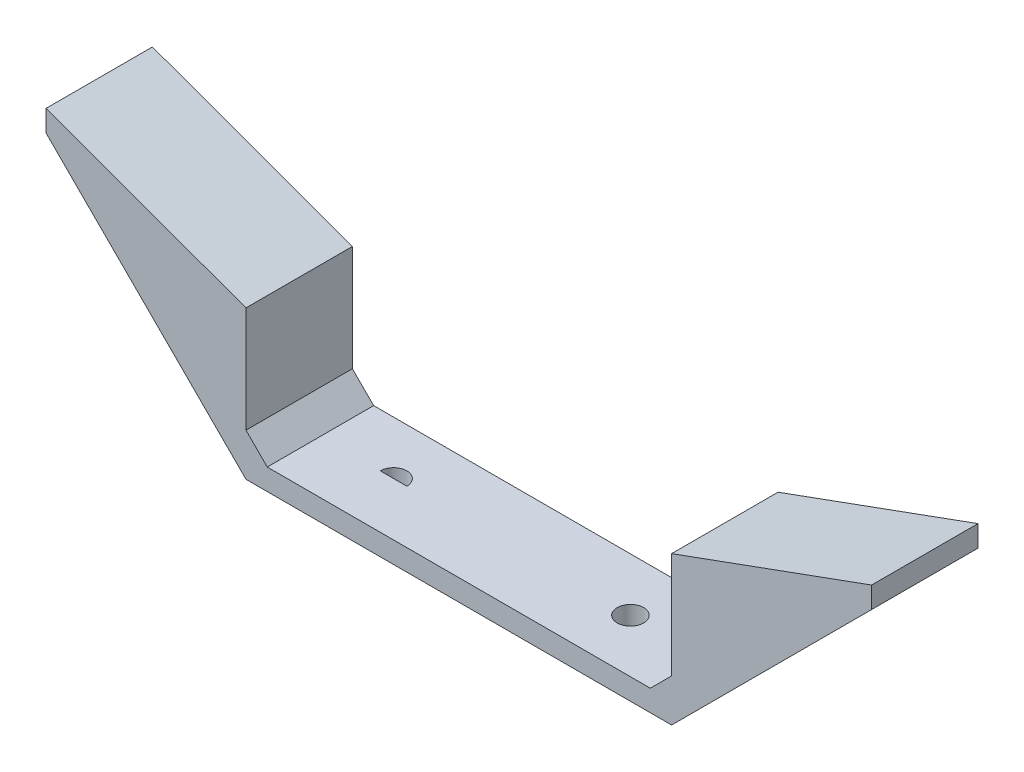
ISO-10303-21;
HEADER;
FILE_DESCRIPTION(('STEP AP214'),'2;1');
FILE_NAME('part.step','',(''),(''),'','','');
FILE_SCHEMA(('AUTOMOTIVE_DESIGN { 1 0 10303 214 1 1 1 1 }'));
ENDSEC;
DATA;
#1=APPLICATION_CONTEXT('core data for automotive mechanical design processes');
#2=APPLICATION_PROTOCOL_DEFINITION('international standard','automotive_design',2000,#1);
#3=PRODUCT_CONTEXT('',#1,'mechanical');
#4=PRODUCT('Part','Part','',(#3));
#5=PRODUCT_RELATED_PRODUCT_CATEGORY('part','',(#4));
#6=PRODUCT_DEFINITION_FORMATION('','',#4);
#7=PRODUCT_DEFINITION_CONTEXT('part definition',#1,'design');
#8=PRODUCT_DEFINITION('design','',#6,#7);
#9=PRODUCT_DEFINITION_SHAPE('','',#8);
#10=(LENGTH_UNIT() NAMED_UNIT(*) SI_UNIT(.MILLI.,.METRE.));
#11=(NAMED_UNIT(*) PLANE_ANGLE_UNIT() SI_UNIT($,.RADIAN.));
#12=(NAMED_UNIT(*) SI_UNIT($,.STERADIAN.) SOLID_ANGLE_UNIT());
#13=UNCERTAINTY_MEASURE_WITH_UNIT(LENGTH_MEASURE(1.E-05),#10,'distance_accuracy_value','');
#14=(GEOMETRIC_REPRESENTATION_CONTEXT(3) GLOBAL_UNCERTAINTY_ASSIGNED_CONTEXT((#13)) GLOBAL_UNIT_ASSIGNED_CONTEXT((#10,
#11,#12)) REPRESENTATION_CONTEXT('',''));
#15=CARTESIAN_POINT('',(0.,0.,0.));
#16=DIRECTION('',(0.,0.,1.));
#17=DIRECTION('',(1.,0.,0.));
#18=AXIS2_PLACEMENT_3D('',#15,#16,#17);
#19=CARTESIAN_POINT('',(0.,0.,12.7));
#20=DIRECTION('',(0.,1.,0.));
#21=DIRECTION('',(0.,0.,1.));
#22=AXIS2_PLACEMENT_3D('',#19,#20,#21);
#23=PLANE('',#22);
#24=CARTESIAN_POINT('',(-14.1378507622248,0.,6.35));
#25=DIRECTION('',(0.,1.,0.));
#26=DIRECTION('',(0.,0.,1.));
#27=AXIS2_PLACEMENT_3D('',#24,#25,#26);
#28=CIRCLE('',#27,1.5875);
#29=CARTESIAN_POINT('',(-15.7253507622248,0.,6.35));
#30=VERTEX_POINT('',#29);
#31=CARTESIAN_POINT('',(-12.5503507622248,0.,6.35));
#32=VERTEX_POINT('',#31);
#33=EDGE_CURVE('E139',#30,#32,#28,.F.);
#34=ORIENTED_EDGE('',*,*,#33,.F.);
#35=DIRECTION('',(-1.,0.,0.));
#36=VECTOR('',#35,1.);
#37=CARTESIAN_POINT('',(0.,0.,6.35));
#38=LINE('',#37,#36);
#39=EDGE_CURVE('E47',#32,#30,#38,.T.);
#40=ORIENTED_EDGE('',*,*,#39,.F.);
#41=EDGE_LOOP('',(#34,#40));
#42=FACE_BOUND('',#41,.T.);
#43=CARTESIAN_POINT('',(14.1378507622248,0.,6.35));
#44=DIRECTION('',(0.,1.,0.));
#45=DIRECTION('',(0.,0.,1.));
#46=AXIS2_PLACEMENT_3D('',#43,#44,#45);
#47=CIRCLE('',#46,1.5875);
#48=CARTESIAN_POINT('',(14.1378507622248,0.,7.9375));
#49=VERTEX_POINT('',#48);
#50=EDGE_CURVE('E145',#49,#49,#47,.F.);
#51=ORIENTED_EDGE('',*,*,#50,.F.);
#52=EDGE_LOOP('',(#51));
#53=FACE_BOUND('',#52,.T.);
#54=DIRECTION('',(1.,0.,0.));
#55=VECTOR('',#54,1.);
#56=CARTESIAN_POINT('',(0.,0.,0.));
#57=LINE('',#56,#55);
#58=CARTESIAN_POINT('',(-25.4,0.,0.));
#59=VERTEX_POINT('',#58);
#60=CARTESIAN_POINT('',(25.4,0.,0.));
#61=VERTEX_POINT('',#60);
#62=EDGE_CURVE('E199',#59,#61,#57,.T.);
#63=ORIENTED_EDGE('',*,*,#62,.T.);
#64=DIRECTION('',(0.,0.,-1.));
#65=VECTOR('',#64,1.);
#66=CARTESIAN_POINT('',(25.4,0.,12.7));
#67=LINE('',#66,#65);
#68=CARTESIAN_POINT('',(25.4,0.,12.7));
#69=VERTEX_POINT('',#68);
#70=EDGE_CURVE('E11',#69,#61,#67,.T.);
#71=ORIENTED_EDGE('',*,*,#70,.F.);
#72=DIRECTION('',(1.,0.,0.));
#73=VECTOR('',#72,1.);
#74=CARTESIAN_POINT('',(0.,0.,12.7));
#75=LINE('',#74,#73);
#76=CARTESIAN_POINT('',(-25.4,0.,12.7));
#77=VERTEX_POINT('',#76);
#78=EDGE_CURVE('E200',#77,#69,#75,.T.);
#79=ORIENTED_EDGE('',*,*,#78,.F.);
#80=DIRECTION('',(0.,0.,-1.));
#81=VECTOR('',#80,1.);
#82=CARTESIAN_POINT('',(-25.4,0.,12.7));
#83=LINE('',#82,#81);
#84=EDGE_CURVE('E172',#77,#59,#83,.T.);
#85=ORIENTED_EDGE('',*,*,#84,.T.);
#86=EDGE_LOOP('',(#63,#71,#79,#85));
#87=FACE_BOUND('',#86,.T.);
#88=ADVANCED_FACE('F33',(#42,#53,#87),#23,.F.);
#89=CARTESIAN_POINT('',(25.4,0.,12.7));
#90=DIRECTION('',(-0.707106781186549,0.707106781186546,0.));
#91=DIRECTION('',(-0.707106781186546,-0.707106781186549,0.));
#92=AXIS2_PLACEMENT_3D('',#89,#90,#91);
#93=PLANE('',#92);
#94=DIRECTION('',(0.707106781186546,0.707106781186549,0.));
#95=VECTOR('',#94,1.);
#96=CARTESIAN_POINT('',(25.4,0.,0.));
#97=LINE('',#96,#95);
#98=CARTESIAN_POINT('',(49.2681925679621,23.8681925679622,0.));
#99=VERTEX_POINT('',#98);
#100=EDGE_CURVE('E217',#61,#99,#97,.T.);
#101=ORIENTED_EDGE('',*,*,#100,.T.);
#102=DIRECTION('',(0.,0.,-1.));
#103=VECTOR('',#102,1.);
#104=CARTESIAN_POINT('',(49.2681925679621,23.8681925679622,12.7));
#105=LINE('',#104,#103);
#106=CARTESIAN_POINT('',(49.2681925679621,23.8681925679622,12.7));
#107=VERTEX_POINT('',#106);
#108=EDGE_CURVE('E40',#107,#99,#105,.T.);
#109=ORIENTED_EDGE('',*,*,#108,.F.);
#110=DIRECTION('',(0.707106781186546,0.707106781186549,0.));
#111=VECTOR('',#110,1.);
#112=CARTESIAN_POINT('',(25.4,0.,12.7));
#113=LINE('',#112,#111);
#114=EDGE_CURVE('E202',#69,#107,#113,.T.);
#115=ORIENTED_EDGE('',*,*,#114,.F.);
#116=ORIENTED_EDGE('',*,*,#70,.T.);
#117=EDGE_LOOP('',(#101,#109,#115,#116));
#118=FACE_BOUND('',#117,.T.);
#119=ADVANCED_FACE('F267',(#118),#93,.F.);
#120=CARTESIAN_POINT('',(49.2681925679621,23.8681925679622,12.7));
#121=DIRECTION('',(-1.,0.,0.));
#122=DIRECTION('',(0.,0.,1.));
#123=AXIS2_PLACEMENT_3D('',#120,#121,#122);
#124=PLANE('',#123);
#125=DIRECTION('',(0.,1.,0.));
#126=VECTOR('',#125,1.);
#127=CARTESIAN_POINT('',(49.2681925679621,23.8681925679622,0.));
#128=LINE('',#127,#126);
#129=CARTESIAN_POINT('',(49.2681925679621,26.4081925679622,0.));
#130=VERTEX_POINT('',#129);
#131=EDGE_CURVE('E219',#99,#130,#128,.T.);
#132=ORIENTED_EDGE('',*,*,#131,.T.);
#133=DIRECTION('',(0.,0.,-1.));
#134=VECTOR('',#133,1.);
#135=CARTESIAN_POINT('',(49.2681925679621,26.4081925679622,12.7));
#136=LINE('',#135,#134);
#137=CARTESIAN_POINT('',(49.2681925679621,26.4081925679622,12.7));
#138=VERTEX_POINT('',#137);
#139=EDGE_CURVE('E236',#138,#130,#136,.T.);
#140=ORIENTED_EDGE('',*,*,#139,.F.);
#141=DIRECTION('',(0.,1.,0.));
#142=VECTOR('',#141,1.);
#143=CARTESIAN_POINT('',(49.2681925679621,23.8681925679622,12.7));
#144=LINE('',#143,#142);
#145=EDGE_CURVE('E205',#107,#138,#144,.T.);
#146=ORIENTED_EDGE('',*,*,#145,.F.);
#147=ORIENTED_EDGE('',*,*,#108,.T.);
#148=EDGE_LOOP('',(#132,#140,#146,#147));
#149=FACE_BOUND('',#148,.T.);
#150=ADVANCED_FACE('F243',(#149),#124,.F.);
#151=CARTESIAN_POINT('',(25.4,17.7208809274904,12.7));
#152=DIRECTION('',(0.342020143325663,-0.93969262078591,0.));
#153=DIRECTION('',(0.93969262078591,0.342020143325664,0.));
#154=AXIS2_PLACEMENT_3D('',#151,#152,#153);
#155=PLANE('',#154);
#156=DIRECTION('',(-0.93969262078591,-0.342020143325663,0.));
#157=VECTOR('',#156,1.);
#158=CARTESIAN_POINT('',(25.4,17.7208809274904,0.));
#159=LINE('',#158,#157);
#160=CARTESIAN_POINT('',(25.4,17.7208809274904,0.));
#161=VERTEX_POINT('',#160);
#162=EDGE_CURVE('E221',#130,#161,#159,.T.);
#163=ORIENTED_EDGE('',*,*,#162,.T.);
#164=DIRECTION('',(0.,0.,-1.));
#165=VECTOR('',#164,1.);
#166=CARTESIAN_POINT('',(25.4,17.7208809274904,12.7));
#167=LINE('',#166,#165);
#168=CARTESIAN_POINT('',(25.4,17.7208809274904,12.7));
#169=VERTEX_POINT('',#168);
#170=EDGE_CURVE('E233',#169,#161,#167,.T.);
#171=ORIENTED_EDGE('',*,*,#170,.F.);
#172=DIRECTION('',(-0.93969262078591,-0.342020143325663,0.));
#173=VECTOR('',#172,1.);
#174=CARTESIAN_POINT('',(25.4,17.7208809274904,12.7));
#175=LINE('',#174,#173);
#176=EDGE_CURVE('E207',#138,#169,#175,.T.);
#177=ORIENTED_EDGE('',*,*,#176,.F.);
#178=ORIENTED_EDGE('',*,*,#139,.T.);
#179=EDGE_LOOP('',(#163,#171,#177,#178));
#180=FACE_BOUND('',#179,.T.);
#181=ADVANCED_FACE('F255',(#180),#155,.F.);
#182=CARTESIAN_POINT('',(25.4,5.08,12.7));
#183=DIRECTION('',(1.,0.,0.));
#184=DIRECTION('',(0.,0.,-1.));
#185=AXIS2_PLACEMENT_3D('',#182,#183,#184);
#186=PLANE('',#185);
#187=DIRECTION('',(0.,-1.,0.));
#188=VECTOR('',#187,1.);
#189=CARTESIAN_POINT('',(25.4,5.08,0.));
#190=LINE('',#189,#188);
#191=CARTESIAN_POINT('',(25.4,5.08,0.));
#192=VERTEX_POINT('',#191);
#193=EDGE_CURVE('E223',#161,#192,#190,.T.);
#194=ORIENTED_EDGE('',*,*,#193,.T.);
#195=DIRECTION('',(0.,0.,-1.));
#196=VECTOR('',#195,1.);
#197=CARTESIAN_POINT('',(25.4,5.08,12.7));
#198=LINE('',#197,#196);
#199=CARTESIAN_POINT('',(25.4,5.08,12.7));
#200=VERTEX_POINT('',#199);
#201=EDGE_CURVE('E230',#200,#192,#198,.T.);
#202=ORIENTED_EDGE('',*,*,#201,.F.);
#203=DIRECTION('',(0.,-1.,0.));
#204=VECTOR('',#203,1.);
#205=CARTESIAN_POINT('',(25.4,5.08,12.7));
#206=LINE('',#205,#204);
#207=EDGE_CURVE('E209',#169,#200,#206,.T.);
#208=ORIENTED_EDGE('',*,*,#207,.F.);
#209=ORIENTED_EDGE('',*,*,#170,.T.);
#210=EDGE_LOOP('',(#194,#202,#208,#209));
#211=FACE_BOUND('',#210,.T.);
#212=ADVANCED_FACE('F259',(#211),#186,.F.);
#213=CARTESIAN_POINT('',(22.86,2.54,12.7));
#214=DIRECTION('',(0.707106781186547,-0.707106781186548,0.));
#215=DIRECTION('',(0.707106781186548,0.707106781186547,0.));
#216=AXIS2_PLACEMENT_3D('',#213,#214,#215);
#217=PLANE('',#216);
#218=DIRECTION('',(-0.707106781186548,-0.707106781186547,0.));
#219=VECTOR('',#218,1.);
#220=CARTESIAN_POINT('',(22.86,2.54,0.));
#221=LINE('',#220,#219);
#222=CARTESIAN_POINT('',(22.86,2.54,0.));
#223=VERTEX_POINT('',#222);
#224=EDGE_CURVE('E225',#192,#223,#221,.T.);
#225=ORIENTED_EDGE('',*,*,#224,.T.);
#226=DIRECTION('',(0.,0.,-1.));
#227=VECTOR('',#226,1.);
#228=CARTESIAN_POINT('',(22.86,2.54,12.7));
#229=LINE('',#228,#227);
#230=CARTESIAN_POINT('',(22.86,2.54,12.7));
#231=VERTEX_POINT('',#230);
#232=EDGE_CURVE('E215',#231,#223,#229,.T.);
#233=ORIENTED_EDGE('',*,*,#232,.F.);
#234=DIRECTION('',(-0.707106781186548,-0.707106781186547,0.));
#235=VECTOR('',#234,1.);
#236=CARTESIAN_POINT('',(22.86,2.54,12.7));
#237=LINE('',#236,#235);
#238=EDGE_CURVE('E211',#200,#231,#237,.T.);
#239=ORIENTED_EDGE('',*,*,#238,.F.);
#240=ORIENTED_EDGE('',*,*,#201,.T.);
#241=EDGE_LOOP('',(#225,#233,#239,#240));
#242=FACE_BOUND('',#241,.T.);
#243=ADVANCED_FACE('F295',(#242),#217,.F.);
#244=CARTESIAN_POINT('',(0.,2.54,12.7));
#245=DIRECTION('',(0.,-1.,0.));
#246=DIRECTION('',(0.,0.,-1.));
#247=AXIS2_PLACEMENT_3D('',#244,#245,#246);
#248=PLANE('',#247);
#249=CARTESIAN_POINT('',(-14.1378507622248,2.54,6.35));
#250=DIRECTION('',(0.,1.,0.));
#251=DIRECTION('',(0.,0.,1.));
#252=AXIS2_PLACEMENT_3D('',#249,#250,#251);
#253=CIRCLE('',#252,1.5875);
#254=CARTESIAN_POINT('',(-12.5503507622248,2.54,6.35));
#255=VERTEX_POINT('',#254);
#256=CARTESIAN_POINT('',(-15.7253507622248,2.54,6.35));
#257=VERTEX_POINT('',#256);
#258=EDGE_CURVE('E136',#255,#257,#253,.T.);
#259=ORIENTED_EDGE('',*,*,#258,.F.);
#260=DIRECTION('',(1.,0.,0.));
#261=VECTOR('',#260,1.);
#262=CARTESIAN_POINT('',(0.,2.54,6.35));
#263=LINE('',#262,#261);
#264=EDGE_CURVE('E52',#257,#255,#263,.T.);
#265=ORIENTED_EDGE('',*,*,#264,.F.);
#266=EDGE_LOOP('',(#259,#265));
#267=FACE_BOUND('',#266,.T.);
#268=CARTESIAN_POINT('',(14.1378507622248,2.54,6.35));
#269=DIRECTION('',(0.,1.,0.));
#270=DIRECTION('',(0.,0.,1.));
#271=AXIS2_PLACEMENT_3D('',#268,#269,#270);
#272=CIRCLE('',#271,1.5875);
#273=CARTESIAN_POINT('',(14.1378507622248,2.54,7.9375));
#274=VERTEX_POINT('',#273);
#275=EDGE_CURVE('E149',#274,#274,#272,.T.);
#276=ORIENTED_EDGE('',*,*,#275,.F.);
#277=EDGE_LOOP('',(#276));
#278=FACE_BOUND('',#277,.T.);
#279=DIRECTION('',(-1.,0.,0.));
#280=VECTOR('',#279,1.);
#281=CARTESIAN_POINT('',(0.,2.54,0.));
#282=LINE('',#281,#280);
#283=CARTESIAN_POINT('',(-22.86,2.54,0.));
#284=VERTEX_POINT('',#283);
#285=EDGE_CURVE('E203',#223,#284,#282,.T.);
#286=ORIENTED_EDGE('',*,*,#285,.T.);
#287=DIRECTION('',(0.,0.,-1.));
#288=VECTOR('',#287,1.);
#289=CARTESIAN_POINT('',(-22.86,2.54,12.7));
#290=LINE('',#289,#288);
#291=CARTESIAN_POINT('',(-22.86,2.54,12.7));
#292=VERTEX_POINT('',#291);
#293=EDGE_CURVE('E196',#292,#284,#290,.T.);
#294=ORIENTED_EDGE('',*,*,#293,.F.);
#295=DIRECTION('',(-1.,0.,0.));
#296=VECTOR('',#295,1.);
#297=CARTESIAN_POINT('',(0.,2.54,12.7));
#298=LINE('',#297,#296);
#299=EDGE_CURVE('E213',#231,#292,#298,.T.);
#300=ORIENTED_EDGE('',*,*,#299,.F.);
#301=ORIENTED_EDGE('',*,*,#232,.T.);
#302=EDGE_LOOP('',(#286,#294,#300,#301));
#303=FACE_BOUND('',#302,.T.);
#304=ADVANCED_FACE('F293',(#267,#278,#303),#248,.F.);
#305=CARTESIAN_POINT('',(0.,0.,12.7));
#306=DIRECTION('',(0.,0.,-1.));
#307=DIRECTION('',(-1.,0.,0.));
#308=AXIS2_PLACEMENT_3D('',#305,#306,#307);
#309=PLANE('',#308);
#310=ORIENTED_EDGE('',*,*,#299,.T.);
#311=DIRECTION('',(0.707106781186548,-0.707106781186547,0.));
#312=VECTOR('',#311,1.);
#313=CARTESIAN_POINT('',(-22.86,2.54,12.7));
#314=LINE('',#313,#312);
#315=CARTESIAN_POINT('',(-25.4,5.08,12.7));
#316=VERTEX_POINT('',#315);
#317=EDGE_CURVE('E156',#316,#292,#314,.T.);
#318=ORIENTED_EDGE('',*,*,#317,.F.);
#319=DIRECTION('',(0.,-1.,0.));
#320=VECTOR('',#319,1.);
#321=CARTESIAN_POINT('',(-25.4,5.08,12.7));
#322=LINE('',#321,#320);
#323=CARTESIAN_POINT('',(-25.4,17.7208809274904,12.7));
#324=VERTEX_POINT('',#323);
#325=EDGE_CURVE('E159',#324,#316,#322,.T.);
#326=ORIENTED_EDGE('',*,*,#325,.F.);
#327=DIRECTION('',(0.93969262078591,-0.342020143325663,0.));
#328=VECTOR('',#327,1.);
#329=CARTESIAN_POINT('',(-25.4,17.7208809274904,12.7));
#330=LINE('',#329,#328);
#331=CARTESIAN_POINT('',(-49.2681925679621,26.4081925679622,12.7));
#332=VERTEX_POINT('',#331);
#333=EDGE_CURVE('E163',#332,#324,#330,.T.);
#334=ORIENTED_EDGE('',*,*,#333,.F.);
#335=DIRECTION('',(0.,1.,0.));
#336=VECTOR('',#335,1.);
#337=CARTESIAN_POINT('',(-49.2681925679621,23.8681925679622,12.7));
#338=LINE('',#337,#336);
#339=CARTESIAN_POINT('',(-49.2681925679621,23.8681925679622,12.7));
#340=VERTEX_POINT('',#339);
#341=EDGE_CURVE('E166',#340,#332,#338,.T.);
#342=ORIENTED_EDGE('',*,*,#341,.F.);
#343=DIRECTION('',(-0.707106781186546,0.707106781186549,0.));
#344=VECTOR('',#343,1.);
#345=CARTESIAN_POINT('',(-25.4,0.,12.7));
#346=LINE('',#345,#344);
#347=EDGE_CURVE('E169',#77,#340,#346,.T.);
#348=ORIENTED_EDGE('',*,*,#347,.F.);
#349=ORIENTED_EDGE('',*,*,#78,.T.);
#350=ORIENTED_EDGE('',*,*,#114,.T.);
#351=ORIENTED_EDGE('',*,*,#145,.T.);
#352=ORIENTED_EDGE('',*,*,#176,.T.);
#353=ORIENTED_EDGE('',*,*,#207,.T.);
#354=ORIENTED_EDGE('',*,*,#238,.T.);
#355=EDGE_LOOP('',(#310,#318,#326,#334,#342,#348,#349,#350,#351,#352,#353,#354));
#356=FACE_BOUND('',#355,.T.);
#357=ADVANCED_FACE('F263',(#356),#309,.F.);
#358=CARTESIAN_POINT('',(0.,0.,0.));
#359=DIRECTION('',(0.,0.,-1.));
#360=DIRECTION('',(-1.,0.,0.));
#361=AXIS2_PLACEMENT_3D('',#358,#359,#360);
#362=PLANE('',#361);
#363=ORIENTED_EDGE('',*,*,#62,.F.);
#364=DIRECTION('',(-0.707106781186546,0.707106781186549,0.));
#365=VECTOR('',#364,1.);
#366=CARTESIAN_POINT('',(-25.4,0.,0.));
#367=LINE('',#366,#365);
#368=CARTESIAN_POINT('',(-49.2681925679621,23.8681925679622,0.));
#369=VERTEX_POINT('',#368);
#370=EDGE_CURVE('E160',#59,#369,#367,.T.);
#371=ORIENTED_EDGE('',*,*,#370,.T.);
#372=DIRECTION('',(0.,1.,0.));
#373=VECTOR('',#372,1.);
#374=CARTESIAN_POINT('',(-49.2681925679621,23.8681925679622,0.));
#375=LINE('',#374,#373);
#376=CARTESIAN_POINT('',(-49.2681925679621,26.4081925679622,0.));
#377=VERTEX_POINT('',#376);
#378=EDGE_CURVE('E181',#369,#377,#375,.T.);
#379=ORIENTED_EDGE('',*,*,#378,.T.);
#380=DIRECTION('',(0.93969262078591,-0.342020143325663,0.));
#381=VECTOR('',#380,1.);
#382=CARTESIAN_POINT('',(-25.4,17.7208809274904,0.));
#383=LINE('',#382,#381);
#384=CARTESIAN_POINT('',(-25.4,17.7208809274904,0.));
#385=VERTEX_POINT('',#384);
#386=EDGE_CURVE('E178',#377,#385,#383,.T.);
#387=ORIENTED_EDGE('',*,*,#386,.T.);
#388=DIRECTION('',(0.,-1.,0.));
#389=VECTOR('',#388,1.);
#390=CARTESIAN_POINT('',(-25.4,5.08,0.));
#391=LINE('',#390,#389);
#392=CARTESIAN_POINT('',(-25.4,5.08,0.));
#393=VERTEX_POINT('',#392);
#394=EDGE_CURVE('E175',#385,#393,#391,.T.);
#395=ORIENTED_EDGE('',*,*,#394,.T.);
#396=DIRECTION('',(0.707106781186548,-0.707106781186547,0.));
#397=VECTOR('',#396,1.);
#398=CARTESIAN_POINT('',(-22.86,2.54,0.));
#399=LINE('',#398,#397);
#400=EDGE_CURVE('E142',#393,#284,#399,.T.);
#401=ORIENTED_EDGE('',*,*,#400,.T.);
#402=ORIENTED_EDGE('',*,*,#285,.F.);
#403=ORIENTED_EDGE('',*,*,#224,.F.);
#404=ORIENTED_EDGE('',*,*,#193,.F.);
#405=ORIENTED_EDGE('',*,*,#162,.F.);
#406=ORIENTED_EDGE('',*,*,#131,.F.);
#407=ORIENTED_EDGE('',*,*,#100,.F.);
#408=EDGE_LOOP('',(#363,#371,#379,#387,#395,#401,#402,#403,#404,#405,#406,#407));
#409=FACE_BOUND('',#408,.T.);
#410=ADVANCED_FACE('F250',(#409),#362,.T.);
#411=CARTESIAN_POINT('',(-22.86,2.54,12.7));
#412=DIRECTION('',(0.707106781186547,0.707106781186548,0.));
#413=DIRECTION('',(-0.707106781186548,0.707106781186547,0.));
#414=AXIS2_PLACEMENT_3D('',#411,#412,#413);
#415=PLANE('',#414);
#416=ORIENTED_EDGE('',*,*,#400,.F.);
#417=DIRECTION('',(0.,0.,-1.));
#418=VECTOR('',#417,1.);
#419=CARTESIAN_POINT('',(-25.4,5.08,12.7));
#420=LINE('',#419,#418);
#421=EDGE_CURVE('E194',#316,#393,#420,.T.);
#422=ORIENTED_EDGE('',*,*,#421,.F.);
#423=ORIENTED_EDGE('',*,*,#317,.T.);
#424=ORIENTED_EDGE('',*,*,#293,.T.);
#425=EDGE_LOOP('',(#416,#422,#423,#424));
#426=FACE_BOUND('',#425,.T.);
#427=ADVANCED_FACE('F289',(#426),#415,.T.);
#428=CARTESIAN_POINT('',(-25.4,5.08,12.7));
#429=DIRECTION('',(1.,0.,0.));
#430=DIRECTION('',(0.,0.,-1.));
#431=AXIS2_PLACEMENT_3D('',#428,#429,#430);
#432=PLANE('',#431);
#433=ORIENTED_EDGE('',*,*,#394,.F.);
#434=DIRECTION('',(0.,0.,-1.));
#435=VECTOR('',#434,1.);
#436=CARTESIAN_POINT('',(-25.4,17.7208809274904,12.7));
#437=LINE('',#436,#435);
#438=EDGE_CURVE('E192',#324,#385,#437,.T.);
#439=ORIENTED_EDGE('',*,*,#438,.F.);
#440=ORIENTED_EDGE('',*,*,#325,.T.);
#441=ORIENTED_EDGE('',*,*,#421,.T.);
#442=EDGE_LOOP('',(#433,#439,#440,#441));
#443=FACE_BOUND('',#442,.T.);
#444=ADVANCED_FACE('F285',(#443),#432,.T.);
#445=CARTESIAN_POINT('',(-25.4,17.7208809274904,12.7));
#446=DIRECTION('',(0.342020143325663,0.93969262078591,0.));
#447=DIRECTION('',(-0.93969262078591,0.342020143325664,0.));
#448=AXIS2_PLACEMENT_3D('',#445,#446,#447);
#449=PLANE('',#448);
#450=ORIENTED_EDGE('',*,*,#386,.F.);
#451=DIRECTION('',(0.,0.,-1.));
#452=VECTOR('',#451,1.);
#453=CARTESIAN_POINT('',(-49.2681925679621,26.4081925679622,12.7));
#454=LINE('',#453,#452);
#455=EDGE_CURVE('E190',#332,#377,#454,.T.);
#456=ORIENTED_EDGE('',*,*,#455,.F.);
#457=ORIENTED_EDGE('',*,*,#333,.T.);
#458=ORIENTED_EDGE('',*,*,#438,.T.);
#459=EDGE_LOOP('',(#450,#456,#457,#458));
#460=FACE_BOUND('',#459,.T.);
#461=ADVANCED_FACE('F280',(#460),#449,.T.);
#462=CARTESIAN_POINT('',(-49.2681925679621,23.8681925679622,12.7));
#463=DIRECTION('',(-1.,0.,0.));
#464=DIRECTION('',(0.,0.,1.));
#465=AXIS2_PLACEMENT_3D('',#462,#463,#464);
#466=PLANE('',#465);
#467=ORIENTED_EDGE('',*,*,#378,.F.);
#468=DIRECTION('',(0.,0.,-1.));
#469=VECTOR('',#468,1.);
#470=CARTESIAN_POINT('',(-49.2681925679621,23.8681925679622,12.7));
#471=LINE('',#470,#469);
#472=EDGE_CURVE('E188',#340,#369,#471,.T.);
#473=ORIENTED_EDGE('',*,*,#472,.F.);
#474=ORIENTED_EDGE('',*,*,#341,.T.);
#475=ORIENTED_EDGE('',*,*,#455,.T.);
#476=EDGE_LOOP('',(#467,#473,#474,#475));
#477=FACE_BOUND('',#476,.T.);
#478=ADVANCED_FACE('F276',(#477),#466,.T.);
#479=CARTESIAN_POINT('',(-25.4,0.,12.7));
#480=DIRECTION('',(-0.707106781186549,-0.707106781186546,0.));
#481=DIRECTION('',(0.707106781186546,-0.707106781186549,0.));
#482=AXIS2_PLACEMENT_3D('',#479,#480,#481);
#483=PLANE('',#482);
#484=ORIENTED_EDGE('',*,*,#370,.F.);
#485=ORIENTED_EDGE('',*,*,#84,.F.);
#486=ORIENTED_EDGE('',*,*,#347,.T.);
#487=ORIENTED_EDGE('',*,*,#472,.T.);
#488=EDGE_LOOP('',(#484,#485,#486,#487));
#489=FACE_BOUND('',#488,.T.);
#490=ADVANCED_FACE('F273',(#489),#483,.T.);
#491=CARTESIAN_POINT('',(14.1378507622248,-0.00100000000000013,6.35));
#492=DIRECTION('',(0.,1.,0.));
#493=DIRECTION('',(0.,0.,1.));
#494=AXIS2_PLACEMENT_3D('',#491,#492,#493);
#495=CYLINDRICAL_SURFACE('',#494,1.5875);
#496=ORIENTED_EDGE('',*,*,#275,.T.);
#497=EDGE_LOOP('',(#496));
#498=FACE_BOUND('',#497,.T.);
#499=ORIENTED_EDGE('',*,*,#50,.T.);
#500=EDGE_LOOP('',(#499));
#501=FACE_BOUND('',#500,.T.);
#502=ADVANCED_FACE('F387',(#498,#501),#495,.F.);
#503=CARTESIAN_POINT('',(0.,-0.00100000000000013,6.35));
#504=DIRECTION('',(0.,0.,1.));
#505=DIRECTION('',(1.,0.,0.));
#506=AXIS2_PLACEMENT_3D('',#503,#504,#505);
#507=PLANE('',#506);
#508=ORIENTED_EDGE('',*,*,#39,.T.);
#509=DIRECTION('',(0.,1.,0.));
#510=VECTOR('',#509,1.);
#511=CARTESIAN_POINT('',(-15.7253507622248,-0.00100000000000013,6.35));
#512=LINE('',#511,#510);
#513=EDGE_CURVE('E135',#30,#257,#512,.T.);
#514=ORIENTED_EDGE('',*,*,#513,.T.);
#515=ORIENTED_EDGE('',*,*,#264,.T.);
#516=DIRECTION('',(0.,1.,0.));
#517=VECTOR('',#516,1.);
#518=CARTESIAN_POINT('',(-12.5503507622248,-0.00100000000000013,6.35));
#519=LINE('',#518,#517);
#520=EDGE_CURVE('E129',#32,#255,#519,.T.);
#521=ORIENTED_EDGE('',*,*,#520,.F.);
#522=EDGE_LOOP('',(#508,#514,#515,#521));
#523=FACE_BOUND('',#522,.T.);
#524=ADVANCED_FACE('F131',(#523),#507,.F.);
#525=CARTESIAN_POINT('',(-14.1378507622248,-0.00100000000000013,6.35));
#526=DIRECTION('',(0.,1.,0.));
#527=DIRECTION('',(0.,0.,1.));
#528=AXIS2_PLACEMENT_3D('',#525,#526,#527);
#529=CYLINDRICAL_SURFACE('',#528,1.5875);
#530=ORIENTED_EDGE('',*,*,#33,.T.);
#531=ORIENTED_EDGE('',*,*,#520,.T.);
#532=ORIENTED_EDGE('',*,*,#258,.T.);
#533=ORIENTED_EDGE('',*,*,#513,.F.);
#534=EDGE_LOOP('',(#530,#531,#532,#533));
#535=FACE_BOUND('',#534,.T.);
#536=ADVANCED_FACE('F140',(#535),#529,.F.);
#537=CLOSED_SHELL('',(#88,#119,#150,#181,#212,#243,#304,#357,#410,#427,#444,#461,#478,#490,#502,
#524,#536));
#538=MANIFOLD_SOLID_BREP('B2',#537);
#539=ADVANCED_BREP_SHAPE_REPRESENTATION('',(#18,#538),#14);
#540=SHAPE_DEFINITION_REPRESENTATION(#9,#539);
ENDSEC;
END-ISO-10303-21;
